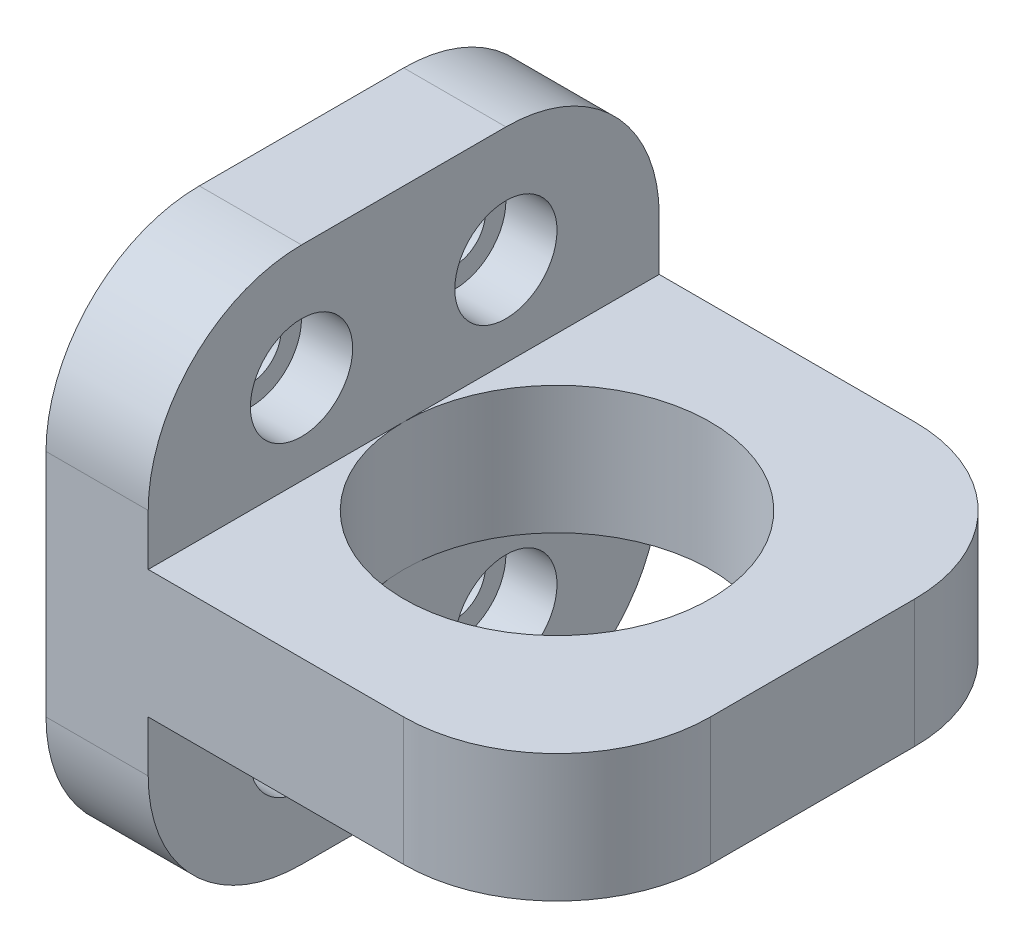
ISO-10303-21;
HEADER;
FILE_DESCRIPTION(('STEP AP214'),'2;1');
FILE_NAME('part.step','',(''),(''),'','','');
FILE_SCHEMA(('AUTOMOTIVE_DESIGN { 1 0 10303 214 1 1 1 1 }'));
ENDSEC;
DATA;
#1=APPLICATION_CONTEXT('core data for automotive mechanical design processes');
#2=APPLICATION_PROTOCOL_DEFINITION('international standard','automotive_design',2000,#1);
#3=PRODUCT_CONTEXT('',#1,'mechanical');
#4=PRODUCT('Part','Part','',(#3));
#5=PRODUCT_RELATED_PRODUCT_CATEGORY('part','',(#4));
#6=PRODUCT_DEFINITION_FORMATION('','',#4);
#7=PRODUCT_DEFINITION_CONTEXT('part definition',#1,'design');
#8=PRODUCT_DEFINITION('design','',#6,#7);
#9=PRODUCT_DEFINITION_SHAPE('','',#8);
#10=(LENGTH_UNIT() NAMED_UNIT(*) SI_UNIT(.MILLI.,.METRE.));
#11=(NAMED_UNIT(*) PLANE_ANGLE_UNIT() SI_UNIT($,.RADIAN.));
#12=(NAMED_UNIT(*) SI_UNIT($,.STERADIAN.) SOLID_ANGLE_UNIT());
#13=UNCERTAINTY_MEASURE_WITH_UNIT(LENGTH_MEASURE(1.E-05),#10,'distance_accuracy_value','');
#14=(GEOMETRIC_REPRESENTATION_CONTEXT(3) GLOBAL_UNCERTAINTY_ASSIGNED_CONTEXT((#13)) GLOBAL_UNIT_ASSIGNED_CONTEXT((#10,
#11,#12)) REPRESENTATION_CONTEXT('',''));
#15=CARTESIAN_POINT('',(0.,0.,0.));
#16=DIRECTION('',(0.,0.,1.));
#17=DIRECTION('',(1.,0.,0.));
#18=AXIS2_PLACEMENT_3D('',#15,#16,#17);
#19=CARTESIAN_POINT('',(5.,4.25,2.00000000000001));
#20=DIRECTION('',(-1.,0.,0.));
#21=DIRECTION('',(0.,0.,1.));
#22=AXIS2_PLACEMENT_3D('',#19,#20,#21);
#23=CYLINDRICAL_SURFACE('',#22,0.6);
#24=CARTESIAN_POINT('',(-5.,4.25,2.00000000000001));
#25=DIRECTION('',(-1.,0.,0.));
#26=DIRECTION('',(0.,0.,1.));
#27=AXIS2_PLACEMENT_3D('',#24,#25,#26);
#28=CIRCLE('',#27,0.6);
#29=CARTESIAN_POINT('',(-5.,4.25,2.6));
#30=VERTEX_POINT('',#29);
#31=EDGE_CURVE('E277',#30,#30,#28,.T.);
#32=ORIENTED_EDGE('',*,*,#31,.T.);
#33=EDGE_LOOP('',(#32));
#34=FACE_BOUND('',#33,.T.);
#35=CARTESIAN_POINT('',(-4.,4.25,2.00000000000001));
#36=DIRECTION('',(1.,0.,0.));
#37=DIRECTION('',(0.,0.,-1.));
#38=AXIS2_PLACEMENT_3D('',#35,#36,#37);
#39=CIRCLE('',#38,0.6);
#40=CARTESIAN_POINT('',(-4.,4.25,1.40000000000001));
#41=VERTEX_POINT('',#40);
#42=EDGE_CURVE('E204',#41,#41,#39,.F.);
#43=ORIENTED_EDGE('',*,*,#42,.F.);
#44=EDGE_LOOP('',(#43));
#45=FACE_BOUND('',#44,.T.);
#46=ADVANCED_FACE('F41',(#34,#45),#23,.F.);
#47=CARTESIAN_POINT('',(5.,4.25,-2.));
#48=DIRECTION('',(-1.,0.,0.));
#49=DIRECTION('',(0.,0.,1.));
#50=AXIS2_PLACEMENT_3D('',#47,#48,#49);
#51=CYLINDRICAL_SURFACE('',#50,0.6);
#52=CARTESIAN_POINT('',(-5.,4.25,-2.));
#53=DIRECTION('',(-1.,0.,0.));
#54=DIRECTION('',(0.,0.,1.));
#55=AXIS2_PLACEMENT_3D('',#52,#53,#54);
#56=CIRCLE('',#55,0.6);
#57=CARTESIAN_POINT('',(-5.,4.25,-1.4));
#58=VERTEX_POINT('',#57);
#59=EDGE_CURVE('E316',#58,#58,#56,.T.);
#60=ORIENTED_EDGE('',*,*,#59,.T.);
#61=EDGE_LOOP('',(#60));
#62=FACE_BOUND('',#61,.T.);
#63=CARTESIAN_POINT('',(-4.,4.25,-2.));
#64=DIRECTION('',(1.,0.,0.));
#65=DIRECTION('',(0.,0.,-1.));
#66=AXIS2_PLACEMENT_3D('',#63,#64,#65);
#67=CIRCLE('',#66,0.6);
#68=CARTESIAN_POINT('',(-4.,4.25,-2.6));
#69=VERTEX_POINT('',#68);
#70=EDGE_CURVE('E201',#69,#69,#67,.F.);
#71=ORIENTED_EDGE('',*,*,#70,.F.);
#72=EDGE_LOOP('',(#71));
#73=FACE_BOUND('',#72,.T.);
#74=ADVANCED_FACE('F375',(#62,#73),#51,.F.);
#75=CARTESIAN_POINT('',(5.,-1.75,2.00000000000001));
#76=DIRECTION('',(-1.,0.,0.));
#77=DIRECTION('',(0.,0.,1.));
#78=AXIS2_PLACEMENT_3D('',#75,#76,#77);
#79=CYLINDRICAL_SURFACE('',#78,0.6);
#80=CARTESIAN_POINT('',(-5.,-1.75,2.00000000000001));
#81=DIRECTION('',(-1.,0.,0.));
#82=DIRECTION('',(0.,0.,1.));
#83=AXIS2_PLACEMENT_3D('',#80,#81,#82);
#84=CIRCLE('',#83,0.6);
#85=CARTESIAN_POINT('',(-5.,-1.75,2.6));
#86=VERTEX_POINT('',#85);
#87=EDGE_CURVE('E272',#86,#86,#84,.T.);
#88=ORIENTED_EDGE('',*,*,#87,.T.);
#89=EDGE_LOOP('',(#88));
#90=FACE_BOUND('',#89,.T.);
#91=CARTESIAN_POINT('',(-4.,-1.75,2.00000000000001));
#92=DIRECTION('',(1.,0.,0.));
#93=DIRECTION('',(0.,0.,-1.));
#94=AXIS2_PLACEMENT_3D('',#91,#92,#93);
#95=CIRCLE('',#94,0.6);
#96=CARTESIAN_POINT('',(-4.,-1.75,1.40000000000001));
#97=VERTEX_POINT('',#96);
#98=EDGE_CURVE('E197',#97,#97,#95,.F.);
#99=ORIENTED_EDGE('',*,*,#98,.F.);
#100=EDGE_LOOP('',(#99));
#101=FACE_BOUND('',#100,.T.);
#102=ADVANCED_FACE('F381',(#90,#101),#79,.F.);
#103=CARTESIAN_POINT('',(5.,-1.75,-2.));
#104=DIRECTION('',(-1.,0.,0.));
#105=DIRECTION('',(0.,0.,1.));
#106=AXIS2_PLACEMENT_3D('',#103,#104,#105);
#107=CYLINDRICAL_SURFACE('',#106,0.6);
#108=CARTESIAN_POINT('',(-5.,-1.75,-2.));
#109=DIRECTION('',(-1.,0.,0.));
#110=DIRECTION('',(0.,0.,1.));
#111=AXIS2_PLACEMENT_3D('',#108,#109,#110);
#112=CIRCLE('',#111,0.6);
#113=CARTESIAN_POINT('',(-5.,-1.75,-1.4));
#114=VERTEX_POINT('',#113);
#115=EDGE_CURVE('E207',#114,#114,#112,.T.);
#116=ORIENTED_EDGE('',*,*,#115,.T.);
#117=EDGE_LOOP('',(#116));
#118=FACE_BOUND('',#117,.T.);
#119=CARTESIAN_POINT('',(-4.,-1.75,-2.));
#120=DIRECTION('',(1.,0.,0.));
#121=DIRECTION('',(0.,0.,-1.));
#122=AXIS2_PLACEMENT_3D('',#119,#120,#121);
#123=CIRCLE('',#122,0.6);
#124=CARTESIAN_POINT('',(-4.,-1.75,-2.6));
#125=VERTEX_POINT('',#124);
#126=EDGE_CURVE('E194',#125,#125,#123,.F.);
#127=ORIENTED_EDGE('',*,*,#126,.F.);
#128=EDGE_LOOP('',(#127));
#129=FACE_BOUND('',#128,.T.);
#130=ADVANCED_FACE('F386',(#118,#129),#107,.F.);
#131=CARTESIAN_POINT('',(0.,2.5,0.));
#132=DIRECTION('',(0.,-1.,0.));
#133=DIRECTION('',(0.,0.,-1.));
#134=AXIS2_PLACEMENT_3D('',#131,#132,#133);
#135=PLANE('',#134);
#136=DIRECTION('',(0.,0.,-1.));
#137=VECTOR('',#136,1.);
#138=CARTESIAN_POINT('',(5.,2.5,5.));
#139=LINE('',#138,#137);
#140=CARTESIAN_POINT('',(5.,2.5,2.));
#141=VERTEX_POINT('',#140);
#142=CARTESIAN_POINT('',(5.,2.5,-2.));
#143=VERTEX_POINT('',#142);
#144=EDGE_CURVE('E177',#141,#143,#139,.T.);
#145=ORIENTED_EDGE('',*,*,#144,.T.);
#146=CARTESIAN_POINT('',(2.,2.5,-2.));
#147=DIRECTION('',(0.,-1.,0.));
#148=DIRECTION('',(0.,0.,-1.));
#149=AXIS2_PLACEMENT_3D('',#146,#147,#148);
#150=CIRCLE('',#149,3.);
#151=CARTESIAN_POINT('',(2.,2.5,-5.));
#152=VERTEX_POINT('',#151);
#153=EDGE_CURVE('E220',#143,#152,#150,.F.);
#154=ORIENTED_EDGE('',*,*,#153,.T.);
#155=DIRECTION('',(-1.,0.,0.));
#156=VECTOR('',#155,1.);
#157=CARTESIAN_POINT('',(-5.,2.5,-5.));
#158=LINE('',#157,#156);
#159=CARTESIAN_POINT('',(-3.,2.5,-5.));
#160=VERTEX_POINT('',#159);
#161=EDGE_CURVE('E181',#152,#160,#158,.T.);
#162=ORIENTED_EDGE('',*,*,#161,.T.);
#163=DIRECTION('',(0.,0.,-1.));
#164=VECTOR('',#163,1.);
#165=CARTESIAN_POINT('',(-3.,2.5,0.));
#166=LINE('',#165,#164);
#167=CARTESIAN_POINT('',(-3.,2.5,0.));
#168=VERTEX_POINT('',#167);
#169=EDGE_CURVE('E160',#168,#160,#166,.T.);
#170=ORIENTED_EDGE('',*,*,#169,.F.);
#171=CARTESIAN_POINT('',(0.,2.5,0.));
#172=DIRECTION('',(0.,1.,0.));
#173=DIRECTION('',(0.,0.,1.));
#174=AXIS2_PLACEMENT_3D('',#171,#172,#173);
#175=CIRCLE('',#174,3.);
#176=EDGE_CURVE('E283',#168,#168,#175,.T.);
#177=ORIENTED_EDGE('',*,*,#176,.F.);
#178=CARTESIAN_POINT('',(-3.,2.5,5.));
#179=VERTEX_POINT('',#178);
#180=EDGE_CURVE('E159',#179,#168,#166,.T.);
#181=ORIENTED_EDGE('',*,*,#180,.F.);
#182=DIRECTION('',(1.,0.,0.));
#183=VECTOR('',#182,1.);
#184=CARTESIAN_POINT('',(-5.,2.5,5.));
#185=LINE('',#184,#183);
#186=CARTESIAN_POINT('',(2.,2.5,5.));
#187=VERTEX_POINT('',#186);
#188=EDGE_CURVE('E190',#179,#187,#185,.T.);
#189=ORIENTED_EDGE('',*,*,#188,.T.);
#190=CARTESIAN_POINT('',(2.,2.5,2.));
#191=DIRECTION('',(0.,-1.,0.));
#192=DIRECTION('',(0.,0.,-1.));
#193=AXIS2_PLACEMENT_3D('',#190,#191,#192);
#194=CIRCLE('',#193,3.);
#195=EDGE_CURVE('E218',#187,#141,#194,.F.);
#196=ORIENTED_EDGE('',*,*,#195,.T.);
#197=EDGE_LOOP('',(#145,#154,#162,#170,#177,#181,#189,#196));
#198=FACE_BOUND('',#197,.T.);
#199=ADVANCED_FACE('F302',(#198),#135,.F.);
#200=CARTESIAN_POINT('',(0.,0.,0.));
#201=DIRECTION('',(0.,-1.,0.));
#202=DIRECTION('',(0.,0.,-1.));
#203=AXIS2_PLACEMENT_3D('',#200,#201,#202);
#204=PLANE('',#203);
#205=DIRECTION('',(-1.,0.,0.));
#206=VECTOR('',#205,1.);
#207=CARTESIAN_POINT('',(-5.,0.,-5.));
#208=LINE('',#207,#206);
#209=CARTESIAN_POINT('',(2.,0.,-5.));
#210=VERTEX_POINT('',#209);
#211=CARTESIAN_POINT('',(-3.,0.,-5.));
#212=VERTEX_POINT('',#211);
#213=EDGE_CURVE('E178',#210,#212,#208,.T.);
#214=ORIENTED_EDGE('',*,*,#213,.F.);
#215=CARTESIAN_POINT('',(2.,0.,-2.));
#216=DIRECTION('',(0.,-1.,0.));
#217=DIRECTION('',(0.,0.,-1.));
#218=AXIS2_PLACEMENT_3D('',#215,#216,#217);
#219=CIRCLE('',#218,3.);
#220=CARTESIAN_POINT('',(5.,0.,-2.));
#221=VERTEX_POINT('',#220);
#222=EDGE_CURVE('E211',#210,#221,#219,.T.);
#223=ORIENTED_EDGE('',*,*,#222,.T.);
#224=DIRECTION('',(0.,0.,-1.));
#225=VECTOR('',#224,1.);
#226=CARTESIAN_POINT('',(5.,0.,5.));
#227=LINE('',#226,#225);
#228=CARTESIAN_POINT('',(5.,0.,2.));
#229=VERTEX_POINT('',#228);
#230=EDGE_CURVE('E183',#229,#221,#227,.T.);
#231=ORIENTED_EDGE('',*,*,#230,.F.);
#232=CARTESIAN_POINT('',(2.,0.,2.));
#233=DIRECTION('',(0.,-1.,0.));
#234=DIRECTION('',(0.,0.,-1.));
#235=AXIS2_PLACEMENT_3D('',#232,#233,#234);
#236=CIRCLE('',#235,3.);
#237=CARTESIAN_POINT('',(2.,0.,5.));
#238=VERTEX_POINT('',#237);
#239=EDGE_CURVE('E176',#229,#238,#236,.T.);
#240=ORIENTED_EDGE('',*,*,#239,.T.);
#241=DIRECTION('',(1.,0.,0.));
#242=VECTOR('',#241,1.);
#243=CARTESIAN_POINT('',(-5.,0.,5.));
#244=LINE('',#243,#242);
#245=CARTESIAN_POINT('',(-3.,0.,5.));
#246=VERTEX_POINT('',#245);
#247=EDGE_CURVE('E166',#246,#238,#244,.T.);
#248=ORIENTED_EDGE('',*,*,#247,.F.);
#249=DIRECTION('',(0.,0.,-1.));
#250=VECTOR('',#249,1.);
#251=CARTESIAN_POINT('',(-3.,0.,0.));
#252=LINE('',#251,#250);
#253=CARTESIAN_POINT('',(-3.,0.,0.));
#254=VERTEX_POINT('',#253);
#255=EDGE_CURVE('E148',#246,#254,#252,.T.);
#256=ORIENTED_EDGE('',*,*,#255,.T.);
#257=CARTESIAN_POINT('',(0.,0.,0.));
#258=DIRECTION('',(0.,1.,0.));
#259=DIRECTION('',(0.,0.,1.));
#260=AXIS2_PLACEMENT_3D('',#257,#258,#259);
#261=CIRCLE('',#260,3.);
#262=EDGE_CURVE('E286',#254,#254,#261,.T.);
#263=ORIENTED_EDGE('',*,*,#262,.T.);
#264=EDGE_CURVE('E155',#254,#212,#252,.T.);
#265=ORIENTED_EDGE('',*,*,#264,.T.);
#266=EDGE_LOOP('',(#214,#223,#231,#240,#248,#256,#263,#265));
#267=FACE_BOUND('',#266,.T.);
#268=ADVANCED_FACE('F174',(#267),#204,.T.);
#269=CARTESIAN_POINT('',(5.,2.5,5.));
#270=DIRECTION('',(-1.,0.,0.));
#271=DIRECTION('',(0.,0.,1.));
#272=AXIS2_PLACEMENT_3D('',#269,#270,#271);
#273=PLANE('',#272);
#274=ORIENTED_EDGE('',*,*,#230,.T.);
#275=DIRECTION('',(0.,-1.,0.));
#276=VECTOR('',#275,1.);
#277=CARTESIAN_POINT('',(5.,2.5,-2.));
#278=LINE('',#277,#276);
#279=EDGE_CURVE('E216',#221,#143,#278,.F.);
#280=ORIENTED_EDGE('',*,*,#279,.T.);
#281=ORIENTED_EDGE('',*,*,#144,.F.);
#282=DIRECTION('',(0.,-1.,0.));
#283=VECTOR('',#282,1.);
#284=CARTESIAN_POINT('',(5.,2.5,2.));
#285=LINE('',#284,#283);
#286=EDGE_CURVE('E213',#141,#229,#285,.T.);
#287=ORIENTED_EDGE('',*,*,#286,.T.);
#288=EDGE_LOOP('',(#274,#280,#281,#287));
#289=FACE_BOUND('',#288,.T.);
#290=ADVANCED_FACE('F293',(#289),#273,.F.);
#291=CARTESIAN_POINT('',(-5.,2.5,-5.));
#292=DIRECTION('',(0.,0.,1.));
#293=DIRECTION('',(1.,0.,0.));
#294=AXIS2_PLACEMENT_3D('',#291,#292,#293);
#295=PLANE('',#294);
#296=DIRECTION('',(0.,-1.,0.));
#297=VECTOR('',#296,1.);
#298=CARTESIAN_POINT('',(-3.,6.5,-5.));
#299=LINE('',#298,#297);
#300=CARTESIAN_POINT('',(-3.,-0.999999999999998,-5.));
#301=VERTEX_POINT('',#300);
#302=EDGE_CURVE('E309',#212,#301,#299,.T.);
#303=ORIENTED_EDGE('',*,*,#302,.T.);
#304=DIRECTION('',(-1.,0.,0.));
#305=VECTOR('',#304,1.);
#306=CARTESIAN_POINT('',(-5.,-1.,-5.));
#307=LINE('',#306,#305);
#308=CARTESIAN_POINT('',(-5.,-1.,-5.));
#309=VERTEX_POINT('',#308);
#310=EDGE_CURVE('E247',#301,#309,#307,.T.);
#311=ORIENTED_EDGE('',*,*,#310,.T.);
#312=DIRECTION('',(0.,-1.,0.));
#313=VECTOR('',#312,1.);
#314=CARTESIAN_POINT('',(-5.,2.5,-5.));
#315=LINE('',#314,#313);
#316=CARTESIAN_POINT('',(-5.,3.5,-5.));
#317=VERTEX_POINT('',#316);
#318=EDGE_CURVE('E189',#317,#309,#315,.T.);
#319=ORIENTED_EDGE('',*,*,#318,.F.);
#320=DIRECTION('',(-1.,0.,0.));
#321=VECTOR('',#320,1.);
#322=CARTESIAN_POINT('',(-3.,3.5,-5.));
#323=LINE('',#322,#321);
#324=CARTESIAN_POINT('',(-3.,3.5,-5.));
#325=VERTEX_POINT('',#324);
#326=EDGE_CURVE('E245',#317,#325,#323,.F.);
#327=ORIENTED_EDGE('',*,*,#326,.T.);
#328=EDGE_CURVE('E306',#325,#160,#299,.T.);
#329=ORIENTED_EDGE('',*,*,#328,.T.);
#330=ORIENTED_EDGE('',*,*,#161,.F.);
#331=DIRECTION('',(0.,-1.,0.));
#332=VECTOR('',#331,1.);
#333=CARTESIAN_POINT('',(2.,2.5,-5.));
#334=LINE('',#333,#332);
#335=EDGE_CURVE('E193',#152,#210,#334,.T.);
#336=ORIENTED_EDGE('',*,*,#335,.T.);
#337=ORIENTED_EDGE('',*,*,#213,.T.);
#338=EDGE_LOOP('',(#303,#311,#319,#327,#329,#330,#336,#337));
#339=FACE_BOUND('',#338,.T.);
#340=ADVANCED_FACE('F305',(#339),#295,.F.);
#341=CARTESIAN_POINT('',(-5.,2.5,5.));
#342=DIRECTION('',(1.,0.,0.));
#343=DIRECTION('',(0.,0.,-1.));
#344=AXIS2_PLACEMENT_3D('',#341,#342,#343);
#345=PLANE('',#344);
#346=ORIENTED_EDGE('',*,*,#115,.F.);
#347=EDGE_LOOP('',(#346));
#348=FACE_BOUND('',#347,.T.);
#349=ORIENTED_EDGE('',*,*,#59,.F.);
#350=EDGE_LOOP('',(#349));
#351=FACE_BOUND('',#350,.T.);
#352=ORIENTED_EDGE('',*,*,#31,.F.);
#353=EDGE_LOOP('',(#352));
#354=FACE_BOUND('',#353,.T.);
#355=ORIENTED_EDGE('',*,*,#87,.F.);
#356=EDGE_LOOP('',(#355));
#357=FACE_BOUND('',#356,.T.);
#358=DIRECTION('',(0.,0.,-1.));
#359=VECTOR('',#358,1.);
#360=CARTESIAN_POINT('',(-5.,-4.,5.));
#361=LINE('',#360,#359);
#362=CARTESIAN_POINT('',(-5.,-4.,2.));
#363=VERTEX_POINT('',#362);
#364=CARTESIAN_POINT('',(-5.,-4.,-2.));
#365=VERTEX_POINT('',#364);
#366=EDGE_CURVE('E271',#363,#365,#361,.T.);
#367=ORIENTED_EDGE('',*,*,#366,.F.);
#368=CARTESIAN_POINT('',(-5.,-1.,2.));
#369=DIRECTION('',(1.,0.,0.));
#370=DIRECTION('',(0.,0.,-1.));
#371=AXIS2_PLACEMENT_3D('',#368,#369,#370);
#372=CIRCLE('',#371,3.);
#373=CARTESIAN_POINT('',(-5.,-1.,5.));
#374=VERTEX_POINT('',#373);
#375=EDGE_CURVE('E235',#363,#374,#372,.F.);
#376=ORIENTED_EDGE('',*,*,#375,.T.);
#377=DIRECTION('',(0.,-1.,0.));
#378=VECTOR('',#377,1.);
#379=CARTESIAN_POINT('',(-5.,2.5,5.));
#380=LINE('',#379,#378);
#381=CARTESIAN_POINT('',(-5.,3.5,5.));
#382=VERTEX_POINT('',#381);
#383=EDGE_CURVE('E187',#382,#374,#380,.T.);
#384=ORIENTED_EDGE('',*,*,#383,.F.);
#385=CARTESIAN_POINT('',(-5.,3.5,2.));
#386=DIRECTION('',(1.,0.,0.));
#387=DIRECTION('',(0.,0.,-1.));
#388=AXIS2_PLACEMENT_3D('',#385,#386,#387);
#389=CIRCLE('',#388,3.);
#390=CARTESIAN_POINT('',(-5.,6.5,2.));
#391=VERTEX_POINT('',#390);
#392=EDGE_CURVE('E229',#382,#391,#389,.F.);
#393=ORIENTED_EDGE('',*,*,#392,.T.);
#394=DIRECTION('',(0.,0.,-1.));
#395=VECTOR('',#394,1.);
#396=CARTESIAN_POINT('',(-5.,6.5,5.));
#397=LINE('',#396,#395);
#398=CARTESIAN_POINT('',(-5.,6.5,-2.));
#399=VERTEX_POINT('',#398);
#400=EDGE_CURVE('E268',#391,#399,#397,.T.);
#401=ORIENTED_EDGE('',*,*,#400,.T.);
#402=CARTESIAN_POINT('',(-5.,3.5,-2.));
#403=DIRECTION('',(1.,0.,0.));
#404=DIRECTION('',(0.,0.,-1.));
#405=AXIS2_PLACEMENT_3D('',#402,#403,#404);
#406=CIRCLE('',#405,3.);
#407=EDGE_CURVE('E231',#399,#317,#406,.F.);
#408=ORIENTED_EDGE('',*,*,#407,.T.);
#409=ORIENTED_EDGE('',*,*,#318,.T.);
#410=CARTESIAN_POINT('',(-5.,-1.,-2.));
#411=DIRECTION('',(1.,0.,0.));
#412=DIRECTION('',(0.,0.,-1.));
#413=AXIS2_PLACEMENT_3D('',#410,#411,#412);
#414=CIRCLE('',#413,3.);
#415=EDGE_CURVE('E233',#309,#365,#414,.F.);
#416=ORIENTED_EDGE('',*,*,#415,.T.);
#417=EDGE_LOOP('',(#367,#376,#384,#393,#401,#408,#409,#416));
#418=FACE_BOUND('',#417,.T.);
#419=ADVANCED_FACE('F267',(#348,#351,#354,#357,#418),#345,.F.);
#420=CARTESIAN_POINT('',(-5.,2.5,5.));
#421=DIRECTION('',(0.,0.,-1.));
#422=DIRECTION('',(-1.,0.,0.));
#423=AXIS2_PLACEMENT_3D('',#420,#421,#422);
#424=PLANE('',#423);
#425=ORIENTED_EDGE('',*,*,#383,.T.);
#426=DIRECTION('',(-1.,0.,0.));
#427=VECTOR('',#426,1.);
#428=CARTESIAN_POINT('',(-5.,-1.,5.));
#429=LINE('',#428,#427);
#430=CARTESIAN_POINT('',(-3.,-0.999999999999998,5.));
#431=VERTEX_POINT('',#430);
#432=EDGE_CURVE('E169',#374,#431,#429,.F.);
#433=ORIENTED_EDGE('',*,*,#432,.T.);
#434=DIRECTION('',(0.,-1.,0.));
#435=VECTOR('',#434,1.);
#436=CARTESIAN_POINT('',(-3.,6.5,5.));
#437=LINE('',#436,#435);
#438=EDGE_CURVE('E151',#246,#431,#437,.T.);
#439=ORIENTED_EDGE('',*,*,#438,.F.);
#440=ORIENTED_EDGE('',*,*,#247,.T.);
#441=DIRECTION('',(0.,-1.,0.));
#442=VECTOR('',#441,1.);
#443=CARTESIAN_POINT('',(2.,2.5,5.));
#444=LINE('',#443,#442);
#445=EDGE_CURVE('E222',#238,#187,#444,.F.);
#446=ORIENTED_EDGE('',*,*,#445,.T.);
#447=ORIENTED_EDGE('',*,*,#188,.F.);
#448=CARTESIAN_POINT('',(-3.,3.5,5.));
#449=VERTEX_POINT('',#448);
#450=EDGE_CURVE('E170',#449,#179,#437,.T.);
#451=ORIENTED_EDGE('',*,*,#450,.F.);
#452=DIRECTION('',(-1.,0.,0.));
#453=VECTOR('',#452,1.);
#454=CARTESIAN_POINT('',(-5.,3.5,5.));
#455=LINE('',#454,#453);
#456=EDGE_CURVE('E237',#449,#382,#455,.T.);
#457=ORIENTED_EDGE('',*,*,#456,.T.);
#458=EDGE_LOOP('',(#425,#433,#439,#440,#446,#447,#451,#457));
#459=FACE_BOUND('',#458,.T.);
#460=ADVANCED_FACE('F165',(#459),#424,.F.);
#461=CARTESIAN_POINT('',(0.,2.5,0.));
#462=DIRECTION('',(0.,-1.,0.));
#463=DIRECTION('',(0.,0.,-1.));
#464=AXIS2_PLACEMENT_3D('',#461,#462,#463);
#465=CYLINDRICAL_SURFACE('',#464,3.);
#466=ORIENTED_EDGE('',*,*,#262,.F.);
#467=EDGE_LOOP('',(#466));
#468=FACE_BOUND('',#467,.T.);
#469=ORIENTED_EDGE('',*,*,#176,.T.);
#470=EDGE_LOOP('',(#469));
#471=FACE_BOUND('',#470,.T.);
#472=ADVANCED_FACE('F396',(#468,#471),#465,.F.);
#473=CARTESIAN_POINT('',(-3.,-4.,5.));
#474=DIRECTION('',(0.,1.,0.));
#475=DIRECTION('',(0.,0.,1.));
#476=AXIS2_PLACEMENT_3D('',#473,#474,#475);
#477=PLANE('',#476);
#478=DIRECTION('',(0.,0.,-1.));
#479=VECTOR('',#478,1.);
#480=CARTESIAN_POINT('',(-3.,-4.,5.));
#481=LINE('',#480,#479);
#482=CARTESIAN_POINT('',(-3.,-4.,2.));
#483=VERTEX_POINT('',#482);
#484=CARTESIAN_POINT('',(-3.,-4.,-2.));
#485=VERTEX_POINT('',#484);
#486=EDGE_CURVE('E171',#483,#485,#481,.T.);
#487=ORIENTED_EDGE('',*,*,#486,.F.);
#488=DIRECTION('',(-1.,0.,0.));
#489=VECTOR('',#488,1.);
#490=CARTESIAN_POINT('',(-3.,-4.,2.));
#491=LINE('',#490,#489);
#492=EDGE_CURVE('E226',#483,#363,#491,.T.);
#493=ORIENTED_EDGE('',*,*,#492,.T.);
#494=ORIENTED_EDGE('',*,*,#366,.T.);
#495=DIRECTION('',(-1.,0.,0.));
#496=VECTOR('',#495,1.);
#497=CARTESIAN_POINT('',(-3.,-4.,-2.));
#498=LINE('',#497,#496);
#499=EDGE_CURVE('E224',#365,#485,#498,.F.);
#500=ORIENTED_EDGE('',*,*,#499,.T.);
#501=EDGE_LOOP('',(#487,#493,#494,#500));
#502=FACE_BOUND('',#501,.T.);
#503=ADVANCED_FACE('F393',(#502),#477,.F.);
#504=CARTESIAN_POINT('',(-3.,0.,0.));
#505=DIRECTION('',(-1.,0.,0.));
#506=DIRECTION('',(0.,0.,1.));
#507=AXIS2_PLACEMENT_3D('',#504,#505,#506);
#508=PLANE('',#507);
#509=CARTESIAN_POINT('',(-3.,-1.75,-2.));
#510=DIRECTION('',(-1.,0.,0.));
#511=DIRECTION('',(0.,0.,1.));
#512=AXIS2_PLACEMENT_3D('',#509,#510,#511);
#513=CIRCLE('',#512,1.);
#514=CARTESIAN_POINT('',(-3.,-1.75,-0.999999999999995));
#515=VERTEX_POINT('',#514);
#516=EDGE_CURVE('E327',#515,#515,#513,.T.);
#517=ORIENTED_EDGE('',*,*,#516,.T.);
#518=EDGE_LOOP('',(#517));
#519=FACE_BOUND('',#518,.T.);
#520=CARTESIAN_POINT('',(-3.,-1.75,2.00000000000001));
#521=DIRECTION('',(-1.,0.,0.));
#522=DIRECTION('',(0.,0.,1.));
#523=AXIS2_PLACEMENT_3D('',#520,#521,#522);
#524=CIRCLE('',#523,1.);
#525=CARTESIAN_POINT('',(-3.,-1.75,3.00000000000001));
#526=VERTEX_POINT('',#525);
#527=EDGE_CURVE('E334',#526,#526,#524,.T.);
#528=ORIENTED_EDGE('',*,*,#527,.T.);
#529=EDGE_LOOP('',(#528));
#530=FACE_BOUND('',#529,.T.);
#531=ORIENTED_EDGE('',*,*,#438,.T.);
#532=CARTESIAN_POINT('',(-3.,-1.,2.));
#533=DIRECTION('',(-1.,0.,0.));
#534=DIRECTION('',(0.,0.,1.));
#535=AXIS2_PLACEMENT_3D('',#532,#533,#534);
#536=CIRCLE('',#535,3.);
#537=EDGE_CURVE('E243',#431,#483,#536,.F.);
#538=ORIENTED_EDGE('',*,*,#537,.T.);
#539=ORIENTED_EDGE('',*,*,#486,.T.);
#540=CARTESIAN_POINT('',(-3.,-1.,-2.));
#541=DIRECTION('',(-1.,0.,0.));
#542=DIRECTION('',(0.,0.,1.));
#543=AXIS2_PLACEMENT_3D('',#540,#541,#542);
#544=CIRCLE('',#543,3.);
#545=EDGE_CURVE('E241',#485,#301,#544,.F.);
#546=ORIENTED_EDGE('',*,*,#545,.T.);
#547=ORIENTED_EDGE('',*,*,#302,.F.);
#548=ORIENTED_EDGE('',*,*,#264,.F.);
#549=ORIENTED_EDGE('',*,*,#255,.F.);
#550=EDGE_LOOP('',(#531,#538,#539,#546,#547,#548,#549));
#551=FACE_BOUND('',#550,.T.);
#552=ADVANCED_FACE('F150',(#519,#530,#551),#508,.F.);
#553=CARTESIAN_POINT('',(-3.,4.25,2.00000000000001));
#554=DIRECTION('',(-1.,0.,0.));
#555=DIRECTION('',(0.,0.,1.));
#556=AXIS2_PLACEMENT_3D('',#553,#554,#555);
#557=CIRCLE('',#556,1.);
#558=CARTESIAN_POINT('',(-3.,4.25,3.00000000000001));
#559=VERTEX_POINT('',#558);
#560=EDGE_CURVE('E326',#559,#559,#557,.T.);
#561=ORIENTED_EDGE('',*,*,#560,.T.);
#562=EDGE_LOOP('',(#561));
#563=FACE_BOUND('',#562,.T.);
#564=CARTESIAN_POINT('',(-3.,4.25,-2.));
#565=DIRECTION('',(-1.,0.,0.));
#566=DIRECTION('',(0.,0.,1.));
#567=AXIS2_PLACEMENT_3D('',#564,#565,#566);
#568=CIRCLE('',#567,1.);
#569=CARTESIAN_POINT('',(-3.,4.25,-0.999999999999995));
#570=VERTEX_POINT('',#569);
#571=EDGE_CURVE('E323',#570,#570,#568,.T.);
#572=ORIENTED_EDGE('',*,*,#571,.T.);
#573=EDGE_LOOP('',(#572));
#574=FACE_BOUND('',#573,.T.);
#575=ORIENTED_EDGE('',*,*,#328,.F.);
#576=CARTESIAN_POINT('',(-3.,3.5,-2.));
#577=DIRECTION('',(-1.,0.,0.));
#578=DIRECTION('',(0.,0.,1.));
#579=AXIS2_PLACEMENT_3D('',#576,#577,#578);
#580=CIRCLE('',#579,3.);
#581=CARTESIAN_POINT('',(-3.,6.5,-2.));
#582=VERTEX_POINT('',#581);
#583=EDGE_CURVE('E12',#325,#582,#580,.F.);
#584=ORIENTED_EDGE('',*,*,#583,.T.);
#585=DIRECTION('',(0.,0.,-1.));
#586=VECTOR('',#585,1.);
#587=CARTESIAN_POINT('',(-3.,6.5,5.));
#588=LINE('',#587,#586);
#589=CARTESIAN_POINT('',(-3.,6.5,2.));
#590=VERTEX_POINT('',#589);
#591=EDGE_CURVE('E258',#590,#582,#588,.T.);
#592=ORIENTED_EDGE('',*,*,#591,.F.);
#593=CARTESIAN_POINT('',(-3.,3.5,2.));
#594=DIRECTION('',(-1.,0.,0.));
#595=DIRECTION('',(0.,0.,1.));
#596=AXIS2_PLACEMENT_3D('',#593,#594,#595);
#597=CIRCLE('',#596,3.);
#598=EDGE_CURVE('E49',#590,#449,#597,.F.);
#599=ORIENTED_EDGE('',*,*,#598,.T.);
#600=ORIENTED_EDGE('',*,*,#450,.T.);
#601=ORIENTED_EDGE('',*,*,#180,.T.);
#602=ORIENTED_EDGE('',*,*,#169,.T.);
#603=EDGE_LOOP('',(#575,#584,#592,#599,#600,#601,#602));
#604=FACE_BOUND('',#603,.T.);
#605=ADVANCED_FACE('F255',(#563,#574,#604),#508,.F.);
#606=CARTESIAN_POINT('',(-3.,6.5,5.));
#607=DIRECTION('',(0.,1.,0.));
#608=DIRECTION('',(0.,0.,1.));
#609=AXIS2_PLACEMENT_3D('',#606,#607,#608);
#610=PLANE('',#609);
#611=ORIENTED_EDGE('',*,*,#591,.T.);
#612=DIRECTION('',(-1.,0.,0.));
#613=VECTOR('',#612,1.);
#614=CARTESIAN_POINT('',(-5.,6.5,-2.));
#615=LINE('',#614,#613);
#616=EDGE_CURVE('E251',#582,#399,#615,.T.);
#617=ORIENTED_EDGE('',*,*,#616,.T.);
#618=ORIENTED_EDGE('',*,*,#400,.F.);
#619=DIRECTION('',(-1.,0.,0.));
#620=VECTOR('',#619,1.);
#621=CARTESIAN_POINT('',(-3.,6.5,2.));
#622=LINE('',#621,#620);
#623=EDGE_CURVE('E61',#391,#590,#622,.F.);
#624=ORIENTED_EDGE('',*,*,#623,.T.);
#625=EDGE_LOOP('',(#611,#617,#618,#624));
#626=FACE_BOUND('',#625,.T.);
#627=ADVANCED_FACE('F269',(#626),#610,.T.);
#628=CARTESIAN_POINT('',(-4.,2.5,5.));
#629=DIRECTION('',(1.,0.,0.));
#630=DIRECTION('',(0.,0.,-1.));
#631=AXIS2_PLACEMENT_3D('',#628,#629,#630);
#632=PLANE('',#631);
#633=CARTESIAN_POINT('',(-4.,-1.75,-2.));
#634=DIRECTION('',(1.,0.,0.));
#635=DIRECTION('',(0.,0.,-1.));
#636=AXIS2_PLACEMENT_3D('',#633,#634,#635);
#637=CIRCLE('',#636,1.);
#638=CARTESIAN_POINT('',(-4.,-1.75,-3.));
#639=VERTEX_POINT('',#638);
#640=EDGE_CURVE('E331',#639,#639,#637,.T.);
#641=ORIENTED_EDGE('',*,*,#640,.T.);
#642=EDGE_LOOP('',(#641));
#643=FACE_BOUND('',#642,.T.);
#644=ORIENTED_EDGE('',*,*,#126,.T.);
#645=EDGE_LOOP('',(#644));
#646=FACE_BOUND('',#645,.T.);
#647=ADVANCED_FACE('F400',(#643,#646),#632,.T.);
#648=CARTESIAN_POINT('',(-7.82842712474619,-1.75,-2.));
#649=DIRECTION('',(1.,0.,0.));
#650=DIRECTION('',(0.,0.,-1.));
#651=AXIS2_PLACEMENT_3D('',#648,#649,#650);
#652=CYLINDRICAL_SURFACE('',#651,1.);
#653=ORIENTED_EDGE('',*,*,#640,.F.);
#654=EDGE_LOOP('',(#653));
#655=FACE_BOUND('',#654,.T.);
#656=ORIENTED_EDGE('',*,*,#516,.F.);
#657=EDGE_LOOP('',(#656));
#658=FACE_BOUND('',#657,.T.);
#659=ADVANCED_FACE('F594',(#655,#658),#652,.F.);
#660=CARTESIAN_POINT('',(-4.,2.5,5.));
#661=DIRECTION('',(1.,0.,0.));
#662=DIRECTION('',(0.,0.,-1.));
#663=AXIS2_PLACEMENT_3D('',#660,#661,#662);
#664=PLANE('',#663);
#665=CARTESIAN_POINT('',(-4.,-1.75,2.00000000000001));
#666=DIRECTION('',(1.,0.,0.));
#667=DIRECTION('',(0.,0.,-1.));
#668=AXIS2_PLACEMENT_3D('',#665,#666,#667);
#669=CIRCLE('',#668,1.);
#670=CARTESIAN_POINT('',(-4.,-1.75,1.00000000000001));
#671=VERTEX_POINT('',#670);
#672=EDGE_CURVE('E330',#671,#671,#669,.T.);
#673=ORIENTED_EDGE('',*,*,#672,.T.);
#674=EDGE_LOOP('',(#673));
#675=FACE_BOUND('',#674,.T.);
#676=ORIENTED_EDGE('',*,*,#98,.T.);
#677=EDGE_LOOP('',(#676));
#678=FACE_BOUND('',#677,.T.);
#679=ADVANCED_FACE('F583',(#675,#678),#664,.T.);
#680=CARTESIAN_POINT('',(-7.82842712474619,-1.75,2.00000000000001));
#681=DIRECTION('',(1.,0.,0.));
#682=DIRECTION('',(0.,0.,-1.));
#683=AXIS2_PLACEMENT_3D('',#680,#681,#682);
#684=CYLINDRICAL_SURFACE('',#683,1.);
#685=ORIENTED_EDGE('',*,*,#672,.F.);
#686=EDGE_LOOP('',(#685));
#687=FACE_BOUND('',#686,.T.);
#688=ORIENTED_EDGE('',*,*,#527,.F.);
#689=EDGE_LOOP('',(#688));
#690=FACE_BOUND('',#689,.T.);
#691=ADVANCED_FACE('F369',(#687,#690),#684,.F.);
#692=CARTESIAN_POINT('',(-4.,2.5,5.));
#693=DIRECTION('',(1.,0.,0.));
#694=DIRECTION('',(0.,0.,-1.));
#695=AXIS2_PLACEMENT_3D('',#692,#693,#694);
#696=PLANE('',#695);
#697=CARTESIAN_POINT('',(-4.,4.25,-2.));
#698=DIRECTION('',(1.,0.,0.));
#699=DIRECTION('',(0.,0.,-1.));
#700=AXIS2_PLACEMENT_3D('',#697,#698,#699);
#701=CIRCLE('',#700,1.);
#702=CARTESIAN_POINT('',(-4.,4.25,-3.));
#703=VERTEX_POINT('',#702);
#704=EDGE_CURVE('E198',#703,#703,#701,.T.);
#705=ORIENTED_EDGE('',*,*,#704,.T.);
#706=EDGE_LOOP('',(#705));
#707=FACE_BOUND('',#706,.T.);
#708=ORIENTED_EDGE('',*,*,#70,.T.);
#709=EDGE_LOOP('',(#708));
#710=FACE_BOUND('',#709,.T.);
#711=ADVANCED_FACE('F361',(#707,#710),#696,.T.);
#712=CARTESIAN_POINT('',(-7.82842712474619,4.25,-2.));
#713=DIRECTION('',(1.,0.,0.));
#714=DIRECTION('',(0.,0.,-1.));
#715=AXIS2_PLACEMENT_3D('',#712,#713,#714);
#716=CYLINDRICAL_SURFACE('',#715,1.);
#717=ORIENTED_EDGE('',*,*,#704,.F.);
#718=EDGE_LOOP('',(#717));
#719=FACE_BOUND('',#718,.T.);
#720=ORIENTED_EDGE('',*,*,#571,.F.);
#721=EDGE_LOOP('',(#720));
#722=FACE_BOUND('',#721,.T.);
#723=ADVANCED_FACE('F359',(#719,#722),#716,.F.);
#724=CARTESIAN_POINT('',(-4.,2.5,5.));
#725=DIRECTION('',(1.,0.,0.));
#726=DIRECTION('',(0.,0.,-1.));
#727=AXIS2_PLACEMENT_3D('',#724,#725,#726);
#728=PLANE('',#727);
#729=CARTESIAN_POINT('',(-4.,4.25,2.00000000000001));
#730=DIRECTION('',(1.,0.,0.));
#731=DIRECTION('',(0.,0.,-1.));
#732=AXIS2_PLACEMENT_3D('',#729,#730,#731);
#733=CIRCLE('',#732,1.);
#734=CARTESIAN_POINT('',(-4.,4.25,1.00000000000001));
#735=VERTEX_POINT('',#734);
#736=EDGE_CURVE('E337',#735,#735,#733,.T.);
#737=ORIENTED_EDGE('',*,*,#736,.T.);
#738=EDGE_LOOP('',(#737));
#739=FACE_BOUND('',#738,.T.);
#740=ORIENTED_EDGE('',*,*,#42,.T.);
#741=EDGE_LOOP('',(#740));
#742=FACE_BOUND('',#741,.T.);
#743=ADVANCED_FACE('F345',(#739,#742),#728,.T.);
#744=CARTESIAN_POINT('',(-7.82842712474619,4.25,2.00000000000001));
#745=DIRECTION('',(1.,0.,0.));
#746=DIRECTION('',(0.,0.,-1.));
#747=AXIS2_PLACEMENT_3D('',#744,#745,#746);
#748=CYLINDRICAL_SURFACE('',#747,1.);
#749=ORIENTED_EDGE('',*,*,#736,.F.);
#750=EDGE_LOOP('',(#749));
#751=FACE_BOUND('',#750,.T.);
#752=ORIENTED_EDGE('',*,*,#560,.F.);
#753=EDGE_LOOP('',(#752));
#754=FACE_BOUND('',#753,.T.);
#755=ADVANCED_FACE('F348',(#751,#754),#748,.F.);
#756=CARTESIAN_POINT('',(2.,2.5,-2.));
#757=DIRECTION('',(0.,-1.,0.));
#758=DIRECTION('',(0.,0.,-1.));
#759=AXIS2_PLACEMENT_3D('',#756,#757,#758);
#760=CYLINDRICAL_SURFACE('',#759,3.);
#761=ORIENTED_EDGE('',*,*,#153,.F.);
#762=ORIENTED_EDGE('',*,*,#279,.F.);
#763=ORIENTED_EDGE('',*,*,#222,.F.);
#764=ORIENTED_EDGE('',*,*,#335,.F.);
#765=EDGE_LOOP('',(#761,#762,#763,#764));
#766=FACE_BOUND('',#765,.T.);
#767=ADVANCED_FACE('F298',(#766),#760,.T.);
#768=CARTESIAN_POINT('',(2.,2.5,2.));
#769=DIRECTION('',(0.,-1.,0.));
#770=DIRECTION('',(0.,0.,-1.));
#771=AXIS2_PLACEMENT_3D('',#768,#769,#770);
#772=CYLINDRICAL_SURFACE('',#771,3.);
#773=ORIENTED_EDGE('',*,*,#195,.F.);
#774=ORIENTED_EDGE('',*,*,#445,.F.);
#775=ORIENTED_EDGE('',*,*,#239,.F.);
#776=ORIENTED_EDGE('',*,*,#286,.F.);
#777=EDGE_LOOP('',(#773,#774,#775,#776));
#778=FACE_BOUND('',#777,.T.);
#779=ADVANCED_FACE('F419',(#778),#772,.T.);
#780=CARTESIAN_POINT('',(-3.,-1.,2.));
#781=DIRECTION('',(-1.,0.,0.));
#782=DIRECTION('',(0.,0.,1.));
#783=AXIS2_PLACEMENT_3D('',#780,#781,#782);
#784=CYLINDRICAL_SURFACE('',#783,3.);
#785=ORIENTED_EDGE('',*,*,#537,.F.);
#786=ORIENTED_EDGE('',*,*,#432,.F.);
#787=ORIENTED_EDGE('',*,*,#375,.F.);
#788=ORIENTED_EDGE('',*,*,#492,.F.);
#789=EDGE_LOOP('',(#785,#786,#787,#788));
#790=FACE_BOUND('',#789,.T.);
#791=ADVANCED_FACE('F422',(#790),#784,.T.);
#792=CARTESIAN_POINT('',(-5.,-1.,-2.));
#793=DIRECTION('',(-1.,0.,0.));
#794=DIRECTION('',(0.,0.,1.));
#795=AXIS2_PLACEMENT_3D('',#792,#793,#794);
#796=CYLINDRICAL_SURFACE('',#795,3.);
#797=ORIENTED_EDGE('',*,*,#545,.F.);
#798=ORIENTED_EDGE('',*,*,#499,.F.);
#799=ORIENTED_EDGE('',*,*,#415,.F.);
#800=ORIENTED_EDGE('',*,*,#310,.F.);
#801=EDGE_LOOP('',(#797,#798,#799,#800));
#802=FACE_BOUND('',#801,.T.);
#803=ADVANCED_FACE('F426',(#802),#796,.T.);
#804=CARTESIAN_POINT('',(-3.,3.5,-2.));
#805=DIRECTION('',(1.,0.,0.));
#806=DIRECTION('',(0.,0.,-1.));
#807=AXIS2_PLACEMENT_3D('',#804,#805,#806);
#808=CYLINDRICAL_SURFACE('',#807,3.);
#809=ORIENTED_EDGE('',*,*,#583,.F.);
#810=ORIENTED_EDGE('',*,*,#326,.F.);
#811=ORIENTED_EDGE('',*,*,#407,.F.);
#812=ORIENTED_EDGE('',*,*,#616,.F.);
#813=EDGE_LOOP('',(#809,#810,#811,#812));
#814=FACE_BOUND('',#813,.T.);
#815=ADVANCED_FACE('F429',(#814),#808,.T.);
#816=CARTESIAN_POINT('',(-5.,3.5,2.));
#817=DIRECTION('',(1.,0.,0.));
#818=DIRECTION('',(0.,0.,-1.));
#819=AXIS2_PLACEMENT_3D('',#816,#817,#818);
#820=CYLINDRICAL_SURFACE('',#819,3.);
#821=ORIENTED_EDGE('',*,*,#598,.F.);
#822=ORIENTED_EDGE('',*,*,#623,.F.);
#823=ORIENTED_EDGE('',*,*,#392,.F.);
#824=ORIENTED_EDGE('',*,*,#456,.F.);
#825=EDGE_LOOP('',(#821,#822,#823,#824));
#826=FACE_BOUND('',#825,.T.);
#827=ADVANCED_FACE('F43',(#826),#820,.T.);
#828=CLOSED_SHELL('',(#46,#74,#102,#130,#199,#268,#290,#340,#419,#460,#472,#503,#552,#605,#627,
#647,#659,#679,#691,#711,#723,#743,#755,#767,#779,#791,#803,#815,#827));
#829=MANIFOLD_SOLID_BREP('B2',#828);
#830=ADVANCED_BREP_SHAPE_REPRESENTATION('',(#18,#829),#14);
#831=SHAPE_DEFINITION_REPRESENTATION(#9,#830);
ENDSEC;
END-ISO-10303-21;
